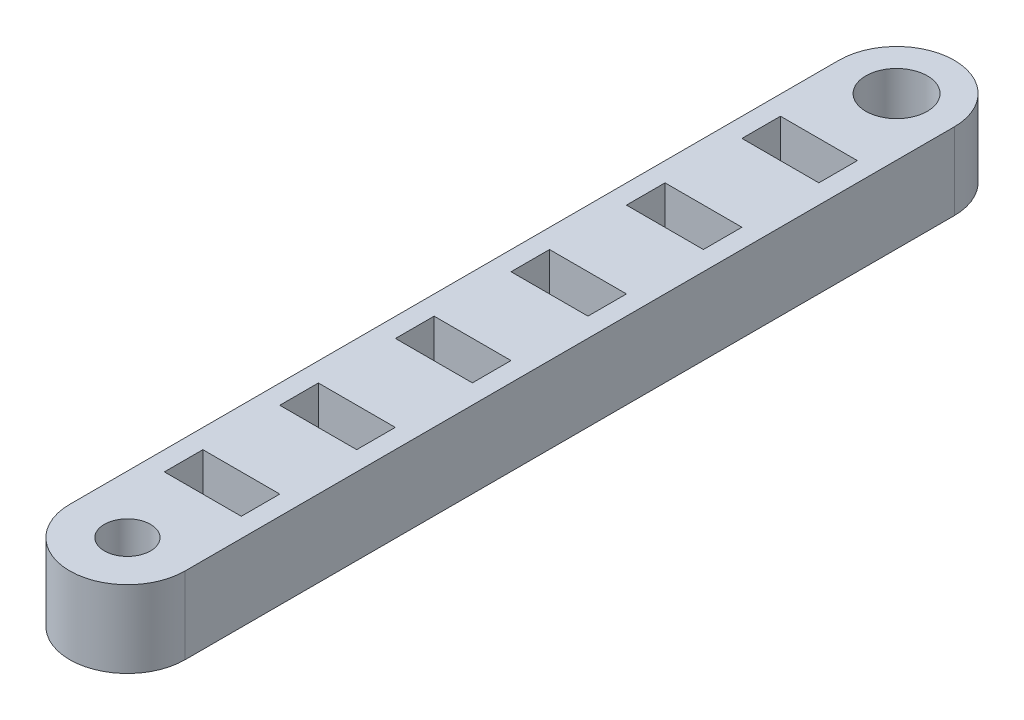
ISO-10303-21;
HEADER;
FILE_DESCRIPTION(('STEP AP214'),'2;1');
FILE_NAME('part.step','',(''),(''),'','','');
FILE_SCHEMA(('AUTOMOTIVE_DESIGN { 1 0 10303 214 1 1 1 1 }'));
ENDSEC;
DATA;
#1=APPLICATION_CONTEXT('core data for automotive mechanical design processes');
#2=APPLICATION_PROTOCOL_DEFINITION('international standard','automotive_design',2000,#1);
#3=PRODUCT_CONTEXT('',#1,'mechanical');
#4=PRODUCT('Part','Part','',(#3));
#5=PRODUCT_RELATED_PRODUCT_CATEGORY('part','',(#4));
#6=PRODUCT_DEFINITION_FORMATION('','',#4);
#7=PRODUCT_DEFINITION_CONTEXT('part definition',#1,'design');
#8=PRODUCT_DEFINITION('design','',#6,#7);
#9=PRODUCT_DEFINITION_SHAPE('','',#8);
#10=(LENGTH_UNIT() NAMED_UNIT(*) SI_UNIT(.MILLI.,.METRE.));
#11=(NAMED_UNIT(*) PLANE_ANGLE_UNIT() SI_UNIT($,.RADIAN.));
#12=(NAMED_UNIT(*) SI_UNIT($,.STERADIAN.) SOLID_ANGLE_UNIT());
#13=UNCERTAINTY_MEASURE_WITH_UNIT(LENGTH_MEASURE(1.E-05),#10,'distance_accuracy_value','');
#14=(GEOMETRIC_REPRESENTATION_CONTEXT(3) GLOBAL_UNCERTAINTY_ASSIGNED_CONTEXT((#13)) GLOBAL_UNIT_ASSIGNED_CONTEXT((#10,
#11,#12)) REPRESENTATION_CONTEXT('',''));
#15=CARTESIAN_POINT('',(0.,0.,0.));
#16=DIRECTION('',(0.,0.,1.));
#17=DIRECTION('',(1.,0.,0.));
#18=AXIS2_PLACEMENT_3D('',#15,#16,#17);
#19=CARTESIAN_POINT('',(5.43082956976471,10.,-63.6643689089613));
#20=DIRECTION('',(0.,-1.,0.));
#21=DIRECTION('',(0.,0.,-1.));
#22=AXIS2_PLACEMENT_3D('',#19,#20,#21);
#23=CYLINDRICAL_SURFACE('',#22,7.5);
#24=CARTESIAN_POINT('',(5.43082956976471,0.,-63.6643689089613));
#25=DIRECTION('',(0.,1.,0.));
#26=DIRECTION('',(0.,0.,1.));
#27=AXIS2_PLACEMENT_3D('',#24,#25,#26);
#28=CIRCLE('',#27,7.5);
#29=CARTESIAN_POINT('',(12.9308295697647,0.,-63.6643689089613));
#30=VERTEX_POINT('',#29);
#31=CARTESIAN_POINT('',(-2.06917043023529,0.,-63.6643689089613));
#32=VERTEX_POINT('',#31);
#33=EDGE_CURVE('E366',#30,#32,#28,.T.);
#34=ORIENTED_EDGE('',*,*,#33,.T.);
#35=DIRECTION('',(0.,-1.,0.));
#36=VECTOR('',#35,1.);
#37=CARTESIAN_POINT('',(-2.06917043023529,10.,-63.6643689089613));
#38=LINE('',#37,#36);
#39=CARTESIAN_POINT('',(-2.06917043023529,10.,-63.6643689089613));
#40=VERTEX_POINT('',#39);
#41=EDGE_CURVE('E382',#40,#32,#38,.T.);
#42=ORIENTED_EDGE('',*,*,#41,.F.);
#43=CARTESIAN_POINT('',(5.43082956976471,10.,-63.6643689089613));
#44=DIRECTION('',(0.,1.,0.));
#45=DIRECTION('',(0.,0.,1.));
#46=AXIS2_PLACEMENT_3D('',#43,#44,#45);
#47=CIRCLE('',#46,7.5);
#48=CARTESIAN_POINT('',(12.9308295697647,10.,-63.6643689089613));
#49=VERTEX_POINT('',#48);
#50=EDGE_CURVE('E355',#49,#40,#47,.T.);
#51=ORIENTED_EDGE('',*,*,#50,.F.);
#52=DIRECTION('',(0.,-1.,0.));
#53=VECTOR('',#52,1.);
#54=CARTESIAN_POINT('',(12.9308295697647,10.,-63.6643689089613));
#55=LINE('',#54,#53);
#56=EDGE_CURVE('E365',#49,#30,#55,.T.);
#57=ORIENTED_EDGE('',*,*,#56,.T.);
#58=EDGE_LOOP('',(#34,#42,#51,#57));
#59=FACE_BOUND('',#58,.T.);
#60=ADVANCED_FACE('F34',(#59),#23,.T.);
#61=CARTESIAN_POINT('',(-2.06917043023529,10.,-63.6643689089613));
#62=DIRECTION('',(1.,0.,0.));
#63=DIRECTION('',(0.,0.,-1.));
#64=AXIS2_PLACEMENT_3D('',#61,#62,#63);
#65=PLANE('',#64);
#66=DIRECTION('',(0.,0.,1.));
#67=VECTOR('',#66,1.);
#68=CARTESIAN_POINT('',(-2.06917043023529,0.,-63.6643689089613));
#69=LINE('',#68,#67);
#70=CARTESIAN_POINT('',(-2.06917043023527,0.,36.3356310910387));
#71=VERTEX_POINT('',#70);
#72=EDGE_CURVE('E369',#32,#71,#69,.T.);
#73=ORIENTED_EDGE('',*,*,#72,.T.);
#74=DIRECTION('',(0.,-1.,0.));
#75=VECTOR('',#74,1.);
#76=CARTESIAN_POINT('',(-2.06917043023527,10.,36.3356310910387));
#77=LINE('',#76,#75);
#78=CARTESIAN_POINT('',(-2.06917043023527,10.,36.3356310910387));
#79=VERTEX_POINT('',#78);
#80=EDGE_CURVE('E379',#79,#71,#77,.T.);
#81=ORIENTED_EDGE('',*,*,#80,.F.);
#82=DIRECTION('',(0.,0.,1.));
#83=VECTOR('',#82,1.);
#84=CARTESIAN_POINT('',(-2.06917043023529,10.,-63.6643689089613));
#85=LINE('',#84,#83);
#86=EDGE_CURVE('E358',#40,#79,#85,.T.);
#87=ORIENTED_EDGE('',*,*,#86,.F.);
#88=ORIENTED_EDGE('',*,*,#41,.T.);
#89=EDGE_LOOP('',(#73,#81,#87,#88));
#90=FACE_BOUND('',#89,.T.);
#91=ADVANCED_FACE('F470',(#90),#65,.F.);
#92=CARTESIAN_POINT('',(5.43082956976472,10.,36.3356310910387));
#93=DIRECTION('',(0.,-1.,0.));
#94=DIRECTION('',(0.,0.,-1.));
#95=AXIS2_PLACEMENT_3D('',#92,#93,#94);
#96=CYLINDRICAL_SURFACE('',#95,7.5);
#97=CARTESIAN_POINT('',(5.43082956976472,0.,36.3356310910387));
#98=DIRECTION('',(0.,1.,0.));
#99=DIRECTION('',(0.,0.,1.));
#100=AXIS2_PLACEMENT_3D('',#97,#98,#99);
#101=CIRCLE('',#100,7.5);
#102=CARTESIAN_POINT('',(12.9308295697647,0.,36.3356310910387));
#103=VERTEX_POINT('',#102);
#104=EDGE_CURVE('E371',#71,#103,#101,.T.);
#105=ORIENTED_EDGE('',*,*,#104,.T.);
#106=DIRECTION('',(0.,-1.,0.));
#107=VECTOR('',#106,1.);
#108=CARTESIAN_POINT('',(12.9308295697647,10.,36.3356310910387));
#109=LINE('',#108,#107);
#110=CARTESIAN_POINT('',(12.9308295697647,10.,36.3356310910387));
#111=VERTEX_POINT('',#110);
#112=EDGE_CURVE('E376',#111,#103,#109,.T.);
#113=ORIENTED_EDGE('',*,*,#112,.F.);
#114=CARTESIAN_POINT('',(5.43082956976472,10.,36.3356310910387));
#115=DIRECTION('',(0.,1.,0.));
#116=DIRECTION('',(0.,0.,1.));
#117=AXIS2_PLACEMENT_3D('',#114,#115,#116);
#118=CIRCLE('',#117,7.5);
#119=EDGE_CURVE('E361',#79,#111,#118,.T.);
#120=ORIENTED_EDGE('',*,*,#119,.F.);
#121=ORIENTED_EDGE('',*,*,#80,.T.);
#122=EDGE_LOOP('',(#105,#113,#120,#121));
#123=FACE_BOUND('',#122,.T.);
#124=ADVANCED_FACE('F475',(#123),#96,.T.);
#125=CARTESIAN_POINT('',(12.9308295697647,10.,-63.6643689089613));
#126=DIRECTION('',(-1.,0.,0.));
#127=DIRECTION('',(0.,0.,1.));
#128=AXIS2_PLACEMENT_3D('',#125,#126,#127);
#129=PLANE('',#128);
#130=DIRECTION('',(0.,0.,-1.));
#131=VECTOR('',#130,1.);
#132=CARTESIAN_POINT('',(12.9308295697647,0.,-63.6643689089613));
#133=LINE('',#132,#131);
#134=EDGE_CURVE('E359',#103,#30,#133,.T.);
#135=ORIENTED_EDGE('',*,*,#134,.T.);
#136=ORIENTED_EDGE('',*,*,#56,.F.);
#137=DIRECTION('',(0.,0.,-1.));
#138=VECTOR('',#137,1.);
#139=CARTESIAN_POINT('',(12.9308295697647,10.,-63.6643689089613));
#140=LINE('',#139,#138);
#141=EDGE_CURVE('E363',#111,#49,#140,.T.);
#142=ORIENTED_EDGE('',*,*,#141,.F.);
#143=ORIENTED_EDGE('',*,*,#112,.T.);
#144=EDGE_LOOP('',(#135,#136,#142,#143));
#145=FACE_BOUND('',#144,.T.);
#146=ADVANCED_FACE('F490',(#145),#129,.F.);
#147=CARTESIAN_POINT('',(5.43082956976471,10.,-63.6643689089613));
#148=DIRECTION('',(0.,1.,0.));
#149=DIRECTION('',(0.,0.,1.));
#150=AXIS2_PLACEMENT_3D('',#147,#148,#149);
#151=PLANE('',#150);
#152=CARTESIAN_POINT('',(5.43082956976472,10.,36.3356310910387));
#153=DIRECTION('',(0.,1.,0.));
#154=DIRECTION('',(0.,0.,1.));
#155=AXIS2_PLACEMENT_3D('',#152,#153,#154);
#156=CIRCLE('',#155,3.);
#157=CARTESIAN_POINT('',(5.43082956976472,10.,39.3356310910387));
#158=VERTEX_POINT('',#157);
#159=EDGE_CURVE('E250',#158,#158,#156,.T.);
#160=ORIENTED_EDGE('',*,*,#159,.F.);
#161=EDGE_LOOP('',(#160));
#162=FACE_BOUND('',#161,.T.);
#163=DIRECTION('',(-1.,0.,0.));
#164=VECTOR('',#163,1.);
#165=CARTESIAN_POINT('',(0.,10.,21.5271605640254));
#166=LINE('',#165,#164);
#167=CARTESIAN_POINT('',(10.4308295697647,10.,21.5271605640254));
#168=VERTEX_POINT('',#167);
#169=CARTESIAN_POINT('',(0.430829569764709,10.,21.5271605640254));
#170=VERTEX_POINT('',#169);
#171=EDGE_CURVE('E49',#168,#170,#166,.T.);
#172=ORIENTED_EDGE('',*,*,#171,.F.);
#173=DIRECTION('',(0.,0.,1.));
#174=VECTOR('',#173,1.);
#175=CARTESIAN_POINT('',(10.4308295697647,10.,0.));
#176=LINE('',#175,#174);
#177=CARTESIAN_POINT('',(10.4308295697647,10.,26.5314364945513));
#178=VERTEX_POINT('',#177);
#179=EDGE_CURVE('E243',#168,#178,#176,.T.);
#180=ORIENTED_EDGE('',*,*,#179,.T.);
#181=DIRECTION('',(-1.,0.,0.));
#182=VECTOR('',#181,1.);
#183=CARTESIAN_POINT('',(0.,10.,26.5314364945513));
#184=LINE('',#183,#182);
#185=CARTESIAN_POINT('',(0.430829569764709,10.,26.5314364945513));
#186=VERTEX_POINT('',#185);
#187=EDGE_CURVE('E226',#178,#186,#184,.T.);
#188=ORIENTED_EDGE('',*,*,#187,.T.);
#189=DIRECTION('',(0.,0.,1.));
#190=VECTOR('',#189,1.);
#191=CARTESIAN_POINT('',(0.430829569764709,10.,0.));
#192=LINE('',#191,#190);
#193=EDGE_CURVE('E236',#170,#186,#192,.T.);
#194=ORIENTED_EDGE('',*,*,#193,.F.);
#195=EDGE_LOOP('',(#172,#180,#188,#194));
#196=FACE_BOUND('',#195,.T.);
#197=DIRECTION('',(-1.,0.,0.));
#198=VECTOR('',#197,1.);
#199=CARTESIAN_POINT('',(0.,10.,6.50984266774373));
#200=LINE('',#199,#198);
#201=CARTESIAN_POINT('',(10.4308295697647,10.,6.50984266774373));
#202=VERTEX_POINT('',#201);
#203=CARTESIAN_POINT('',(0.430829569764708,10.,6.50984266774374));
#204=VERTEX_POINT('',#203);
#205=EDGE_CURVE('E57',#202,#204,#200,.T.);
#206=ORIENTED_EDGE('',*,*,#205,.F.);
#207=DIRECTION('',(0.,0.,1.));
#208=VECTOR('',#207,1.);
#209=CARTESIAN_POINT('',(10.4308295697647,10.,0.));
#210=LINE('',#209,#208);
#211=CARTESIAN_POINT('',(10.4308295697647,10.,11.5271605640254));
#212=VERTEX_POINT('',#211);
#213=EDGE_CURVE('E261',#202,#212,#210,.T.);
#214=ORIENTED_EDGE('',*,*,#213,.T.);
#215=DIRECTION('',(-1.,0.,0.));
#216=VECTOR('',#215,1.);
#217=CARTESIAN_POINT('',(0.,10.,11.5271605640254));
#218=LINE('',#217,#216);
#219=CARTESIAN_POINT('',(0.430829569764709,10.,11.5271605640254));
#220=VERTEX_POINT('',#219);
#221=EDGE_CURVE('E258',#212,#220,#218,.T.);
#222=ORIENTED_EDGE('',*,*,#221,.T.);
#223=DIRECTION('',(0.,0.,1.));
#224=VECTOR('',#223,1.);
#225=CARTESIAN_POINT('',(0.430829569764708,10.,0.));
#226=LINE('',#225,#224);
#227=EDGE_CURVE('E254',#204,#220,#226,.T.);
#228=ORIENTED_EDGE('',*,*,#227,.F.);
#229=EDGE_LOOP('',(#206,#214,#222,#228));
#230=FACE_BOUND('',#229,.T.);
#231=DIRECTION('',(-1.,0.,0.));
#232=VECTOR('',#231,1.);
#233=CARTESIAN_POINT('',(0.,10.,-8.53865228140384));
#234=LINE('',#233,#232);
#235=CARTESIAN_POINT('',(10.4308295697647,10.,-8.53865228140384));
#236=VERTEX_POINT('',#235);
#237=CARTESIAN_POINT('',(0.430829569764709,10.,-8.53865228140384));
#238=VERTEX_POINT('',#237);
#239=EDGE_CURVE('E272',#236,#238,#234,.T.);
#240=ORIENTED_EDGE('',*,*,#239,.F.);
#241=DIRECTION('',(0.,0.,1.));
#242=VECTOR('',#241,1.);
#243=CARTESIAN_POINT('',(10.4308295697647,10.,0.));
#244=LINE('',#243,#242);
#245=CARTESIAN_POINT('',(10.4308295697647,10.,-3.51261248980099));
#246=VERTEX_POINT('',#245);
#247=EDGE_CURVE('E281',#236,#246,#244,.T.);
#248=ORIENTED_EDGE('',*,*,#247,.T.);
#249=DIRECTION('',(-1.,0.,0.));
#250=VECTOR('',#249,1.);
#251=CARTESIAN_POINT('',(0.,10.,-3.51261248980099));
#252=LINE('',#251,#250);
#253=CARTESIAN_POINT('',(0.430829569764709,10.,-3.51261248980099));
#254=VERTEX_POINT('',#253);
#255=EDGE_CURVE('E278',#246,#254,#252,.T.);
#256=ORIENTED_EDGE('',*,*,#255,.T.);
#257=DIRECTION('',(0.,0.,1.));
#258=VECTOR('',#257,1.);
#259=CARTESIAN_POINT('',(0.43082956976471,10.,0.));
#260=LINE('',#259,#258);
#261=EDGE_CURVE('E274',#238,#254,#260,.T.);
#262=ORIENTED_EDGE('',*,*,#261,.F.);
#263=EDGE_LOOP('',(#240,#248,#256,#262));
#264=FACE_BOUND('',#263,.T.);
#265=DIRECTION('',(-1.,0.,0.));
#266=VECTOR('',#265,1.);
#267=CARTESIAN_POINT('',(0.,10.,-23.5445439666619));
#268=LINE('',#267,#266);
#269=CARTESIAN_POINT('',(10.4308295697647,10.,-23.5445439666619));
#270=VERTEX_POINT('',#269);
#271=CARTESIAN_POINT('',(0.430829569764709,10.,-23.5445439666619));
#272=VERTEX_POINT('',#271);
#273=EDGE_CURVE('E292',#270,#272,#268,.T.);
#274=ORIENTED_EDGE('',*,*,#273,.F.);
#275=DIRECTION('',(0.,0.,1.));
#276=VECTOR('',#275,1.);
#277=CARTESIAN_POINT('',(10.4308295697647,10.,0.));
#278=LINE('',#277,#276);
#279=CARTESIAN_POINT('',(10.4308295697647,10.,-18.5386522814038));
#280=VERTEX_POINT('',#279);
#281=EDGE_CURVE('E301',#270,#280,#278,.T.);
#282=ORIENTED_EDGE('',*,*,#281,.T.);
#283=DIRECTION('',(-1.,0.,0.));
#284=VECTOR('',#283,1.);
#285=CARTESIAN_POINT('',(0.,10.,-18.5386522814038));
#286=LINE('',#285,#284);
#287=CARTESIAN_POINT('',(0.430829569764709,10.,-18.5386522814038));
#288=VERTEX_POINT('',#287);
#289=EDGE_CURVE('E298',#280,#288,#286,.T.);
#290=ORIENTED_EDGE('',*,*,#289,.T.);
#291=DIRECTION('',(0.,0.,1.));
#292=VECTOR('',#291,1.);
#293=CARTESIAN_POINT('',(0.430829569764711,10.,0.));
#294=LINE('',#293,#292);
#295=EDGE_CURVE('E294',#272,#288,#294,.T.);
#296=ORIENTED_EDGE('',*,*,#295,.F.);
#297=EDGE_LOOP('',(#274,#282,#290,#296));
#298=FACE_BOUND('',#297,.T.);
#299=DIRECTION('',(-1.,0.,0.));
#300=VECTOR('',#299,1.);
#301=CARTESIAN_POINT('',(0.,10.,-38.5609277801276));
#302=LINE('',#301,#300);
#303=CARTESIAN_POINT('',(10.4308295697647,10.,-38.5609277801276));
#304=VERTEX_POINT('',#303);
#305=CARTESIAN_POINT('',(0.430829569764709,10.,-38.5609277801276));
#306=VERTEX_POINT('',#305);
#307=EDGE_CURVE('E312',#304,#306,#302,.T.);
#308=ORIENTED_EDGE('',*,*,#307,.F.);
#309=DIRECTION('',(0.,0.,1.));
#310=VECTOR('',#309,1.);
#311=CARTESIAN_POINT('',(10.4308295697647,10.,0.));
#312=LINE('',#311,#310);
#313=CARTESIAN_POINT('',(10.4308295697647,10.,-33.5445439666619));
#314=VERTEX_POINT('',#313);
#315=EDGE_CURVE('E321',#304,#314,#312,.T.);
#316=ORIENTED_EDGE('',*,*,#315,.T.);
#317=DIRECTION('',(-1.,0.,0.));
#318=VECTOR('',#317,1.);
#319=CARTESIAN_POINT('',(0.,10.,-33.5445439666619));
#320=LINE('',#319,#318);
#321=CARTESIAN_POINT('',(0.430829569764709,10.,-33.5445439666619));
#322=VERTEX_POINT('',#321);
#323=EDGE_CURVE('E318',#314,#322,#320,.T.);
#324=ORIENTED_EDGE('',*,*,#323,.T.);
#325=DIRECTION('',(0.,0.,1.));
#326=VECTOR('',#325,1.);
#327=CARTESIAN_POINT('',(0.430829569764713,10.,0.));
#328=LINE('',#327,#326);
#329=EDGE_CURVE('E314',#306,#322,#328,.T.);
#330=ORIENTED_EDGE('',*,*,#329,.F.);
#331=EDGE_LOOP('',(#308,#316,#324,#330));
#332=FACE_BOUND('',#331,.T.);
#333=DIRECTION('',(-1.,0.,0.));
#334=VECTOR('',#333,1.);
#335=CARTESIAN_POINT('',(0.,10.,-53.5685338805538));
#336=LINE('',#335,#334);
#337=CARTESIAN_POINT('',(10.4308295697647,10.,-53.5685338805538));
#338=VERTEX_POINT('',#337);
#339=CARTESIAN_POINT('',(0.430829569764709,10.,-53.5685338805538));
#340=VERTEX_POINT('',#339);
#341=EDGE_CURVE('E332',#338,#340,#336,.T.);
#342=ORIENTED_EDGE('',*,*,#341,.F.);
#343=DIRECTION('',(0.,0.,1.));
#344=VECTOR('',#343,1.);
#345=CARTESIAN_POINT('',(10.4308295697647,10.,0.));
#346=LINE('',#345,#344);
#347=CARTESIAN_POINT('',(10.4308295697647,10.,-48.5609277801276));
#348=VERTEX_POINT('',#347);
#349=EDGE_CURVE('E340',#338,#348,#346,.T.);
#350=ORIENTED_EDGE('',*,*,#349,.T.);
#351=DIRECTION('',(-1.,0.,0.));
#352=VECTOR('',#351,1.);
#353=CARTESIAN_POINT('',(0.,10.,-48.5609277801276));
#354=LINE('',#353,#352);
#355=CARTESIAN_POINT('',(0.430829569764709,10.,-48.5609277801276));
#356=VERTEX_POINT('',#355);
#357=EDGE_CURVE('E337',#348,#356,#354,.T.);
#358=ORIENTED_EDGE('',*,*,#357,.T.);
#359=DIRECTION('',(0.,0.,1.));
#360=VECTOR('',#359,1.);
#361=CARTESIAN_POINT('',(0.430829569764715,10.,0.));
#362=LINE('',#361,#360);
#363=EDGE_CURVE('E334',#340,#356,#362,.T.);
#364=ORIENTED_EDGE('',*,*,#363,.F.);
#365=EDGE_LOOP('',(#342,#350,#358,#364));
#366=FACE_BOUND('',#365,.T.);
#367=CARTESIAN_POINT('',(5.43082956976471,10.,-63.6643689089613));
#368=DIRECTION('',(0.,1.,0.));
#369=DIRECTION('',(0.,0.,1.));
#370=AXIS2_PLACEMENT_3D('',#367,#368,#369);
#371=CIRCLE('',#370,4.);
#372=CARTESIAN_POINT('',(5.43082956976471,10.,-59.6643689089613));
#373=VERTEX_POINT('',#372);
#374=EDGE_CURVE('E351',#373,#373,#371,.T.);
#375=ORIENTED_EDGE('',*,*,#374,.F.);
#376=EDGE_LOOP('',(#375));
#377=FACE_BOUND('',#376,.T.);
#378=ORIENTED_EDGE('',*,*,#50,.T.);
#379=ORIENTED_EDGE('',*,*,#86,.T.);
#380=ORIENTED_EDGE('',*,*,#119,.T.);
#381=ORIENTED_EDGE('',*,*,#141,.T.);
#382=EDGE_LOOP('',(#378,#379,#380,#381));
#383=FACE_BOUND('',#382,.T.);
#384=ADVANCED_FACE('F240',(#162,#196,#230,#264,#298,#332,#366,#377,#383),#151,.T.);
#385=CARTESIAN_POINT('',(5.43082956976471,0.,-63.6643689089613));
#386=DIRECTION('',(0.,1.,0.));
#387=DIRECTION('',(0.,0.,1.));
#388=AXIS2_PLACEMENT_3D('',#385,#386,#387);
#389=PLANE('',#388);
#390=CARTESIAN_POINT('',(5.43082956976472,0.,36.3356310910387));
#391=DIRECTION('',(0.,1.,0.));
#392=DIRECTION('',(0.,0.,1.));
#393=AXIS2_PLACEMENT_3D('',#390,#391,#392);
#394=CIRCLE('',#393,3.);
#395=CARTESIAN_POINT('',(5.43082956976472,0.,39.3356310910387));
#396=VERTEX_POINT('',#395);
#397=EDGE_CURVE('E37',#396,#396,#394,.T.);
#398=ORIENTED_EDGE('',*,*,#397,.T.);
#399=EDGE_LOOP('',(#398));
#400=FACE_BOUND('',#399,.T.);
#401=DIRECTION('',(0.,0.,1.));
#402=VECTOR('',#401,1.);
#403=CARTESIAN_POINT('',(10.4308295697647,0.,-63.6643689089613));
#404=LINE('',#403,#402);
#405=CARTESIAN_POINT('',(10.4308295697647,0.,21.5271605640254));
#406=VERTEX_POINT('',#405);
#407=CARTESIAN_POINT('',(10.4308295697647,0.,26.5314364945513));
#408=VERTEX_POINT('',#407);
#409=EDGE_CURVE('E42',#406,#408,#404,.T.);
#410=ORIENTED_EDGE('',*,*,#409,.F.);
#411=DIRECTION('',(-1.,0.,0.));
#412=VECTOR('',#411,1.);
#413=CARTESIAN_POINT('',(5.43082956976471,0.,21.5271605640254));
#414=LINE('',#413,#412);
#415=CARTESIAN_POINT('',(0.430829569764709,0.,21.5271605640254));
#416=VERTEX_POINT('',#415);
#417=EDGE_CURVE('E11',#406,#416,#414,.T.);
#418=ORIENTED_EDGE('',*,*,#417,.T.);
#419=DIRECTION('',(0.,0.,1.));
#420=VECTOR('',#419,1.);
#421=CARTESIAN_POINT('',(0.430829569764709,0.,-63.6643689089613));
#422=LINE('',#421,#420);
#423=CARTESIAN_POINT('',(0.430829569764709,0.,26.5314364945513));
#424=VERTEX_POINT('',#423);
#425=EDGE_CURVE('E442',#416,#424,#422,.T.);
#426=ORIENTED_EDGE('',*,*,#425,.T.);
#427=DIRECTION('',(-1.,0.,0.));
#428=VECTOR('',#427,1.);
#429=CARTESIAN_POINT('',(5.43082956976471,0.,26.5314364945513));
#430=LINE('',#429,#428);
#431=EDGE_CURVE('E229',#408,#424,#430,.T.);
#432=ORIENTED_EDGE('',*,*,#431,.F.);
#433=EDGE_LOOP('',(#410,#418,#426,#432));
#434=FACE_BOUND('',#433,.T.);
#435=DIRECTION('',(0.,0.,1.));
#436=VECTOR('',#435,1.);
#437=CARTESIAN_POINT('',(10.4308295697647,0.,-63.6643689089613));
#438=LINE('',#437,#436);
#439=CARTESIAN_POINT('',(10.4308295697647,0.,6.50984266774373));
#440=VERTEX_POINT('',#439);
#441=CARTESIAN_POINT('',(10.4308295697647,0.,11.5271605640254));
#442=VERTEX_POINT('',#441);
#443=EDGE_CURVE('E437',#440,#442,#438,.T.);
#444=ORIENTED_EDGE('',*,*,#443,.F.);
#445=DIRECTION('',(-1.,0.,0.));
#446=VECTOR('',#445,1.);
#447=CARTESIAN_POINT('',(5.43082956976466,0.,6.50984266774374));
#448=LINE('',#447,#446);
#449=CARTESIAN_POINT('',(0.430829569764709,0.,6.50984266774373));
#450=VERTEX_POINT('',#449);
#451=EDGE_CURVE('E439',#440,#450,#448,.T.);
#452=ORIENTED_EDGE('',*,*,#451,.T.);
#453=DIRECTION('',(0.,0.,1.));
#454=VECTOR('',#453,1.);
#455=CARTESIAN_POINT('',(0.4308295697647,0.,-63.6643689089613));
#456=LINE('',#455,#454);
#457=CARTESIAN_POINT('',(0.430829569764709,0.,11.5271605640254));
#458=VERTEX_POINT('',#457);
#459=EDGE_CURVE('E431',#450,#458,#456,.T.);
#460=ORIENTED_EDGE('',*,*,#459,.T.);
#461=DIRECTION('',(-1.,0.,0.));
#462=VECTOR('',#461,1.);
#463=CARTESIAN_POINT('',(5.43082956976472,0.,11.5271605640254));
#464=LINE('',#463,#462);
#465=EDGE_CURVE('E434',#442,#458,#464,.T.);
#466=ORIENTED_EDGE('',*,*,#465,.F.);
#467=EDGE_LOOP('',(#444,#452,#460,#466));
#468=FACE_BOUND('',#467,.T.);
#469=DIRECTION('',(0.,0.,1.));
#470=VECTOR('',#469,1.);
#471=CARTESIAN_POINT('',(10.4308295697647,0.,-63.6643689089613));
#472=LINE('',#471,#470);
#473=CARTESIAN_POINT('',(10.4308295697647,0.,-8.53865228140384));
#474=VERTEX_POINT('',#473);
#475=CARTESIAN_POINT('',(10.4308295697647,0.,-3.51261248980099));
#476=VERTEX_POINT('',#475);
#477=EDGE_CURVE('E426',#474,#476,#472,.T.);
#478=ORIENTED_EDGE('',*,*,#477,.F.);
#479=DIRECTION('',(-1.,0.,0.));
#480=VECTOR('',#479,1.);
#481=CARTESIAN_POINT('',(5.43082956976471,0.,-8.53865228140384));
#482=LINE('',#481,#480);
#483=CARTESIAN_POINT('',(0.430829569764709,0.,-8.53865228140384));
#484=VERTEX_POINT('',#483);
#485=EDGE_CURVE('E428',#474,#484,#482,.T.);
#486=ORIENTED_EDGE('',*,*,#485,.T.);
#487=DIRECTION('',(0.,0.,1.));
#488=VECTOR('',#487,1.);
#489=CARTESIAN_POINT('',(0.430829569764702,0.,-63.6643689089613));
#490=LINE('',#489,#488);
#491=CARTESIAN_POINT('',(0.430829569764709,0.,-3.51261248980099));
#492=VERTEX_POINT('',#491);
#493=EDGE_CURVE('E420',#484,#492,#490,.T.);
#494=ORIENTED_EDGE('',*,*,#493,.T.);
#495=DIRECTION('',(-1.,0.,0.));
#496=VECTOR('',#495,1.);
#497=CARTESIAN_POINT('',(5.43082956976472,0.,-3.51261248980098));
#498=LINE('',#497,#496);
#499=EDGE_CURVE('E423',#476,#492,#498,.T.);
#500=ORIENTED_EDGE('',*,*,#499,.F.);
#501=EDGE_LOOP('',(#478,#486,#494,#500));
#502=FACE_BOUND('',#501,.T.);
#503=DIRECTION('',(0.,0.,1.));
#504=VECTOR('',#503,1.);
#505=CARTESIAN_POINT('',(10.4308295697647,0.,-63.6643689089613));
#506=LINE('',#505,#504);
#507=CARTESIAN_POINT('',(10.4308295697647,0.,-23.5445439666619));
#508=VERTEX_POINT('',#507);
#509=CARTESIAN_POINT('',(10.4308295697647,0.,-18.5386522814038));
#510=VERTEX_POINT('',#509);
#511=EDGE_CURVE('E415',#508,#510,#506,.T.);
#512=ORIENTED_EDGE('',*,*,#511,.F.);
#513=DIRECTION('',(-1.,0.,0.));
#514=VECTOR('',#513,1.);
#515=CARTESIAN_POINT('',(5.43082956976476,0.,-23.5445439666619));
#516=LINE('',#515,#514);
#517=CARTESIAN_POINT('',(0.430829569764709,0.,-23.5445439666619));
#518=VERTEX_POINT('',#517);
#519=EDGE_CURVE('E417',#508,#518,#516,.T.);
#520=ORIENTED_EDGE('',*,*,#519,.T.);
#521=DIRECTION('',(0.,0.,1.));
#522=VECTOR('',#521,1.);
#523=CARTESIAN_POINT('',(0.430829569764704,0.,-63.6643689089613));
#524=LINE('',#523,#522);
#525=CARTESIAN_POINT('',(0.430829569764709,0.,-18.5386522814038));
#526=VERTEX_POINT('',#525);
#527=EDGE_CURVE('E409',#518,#526,#524,.T.);
#528=ORIENTED_EDGE('',*,*,#527,.T.);
#529=DIRECTION('',(-1.,0.,0.));
#530=VECTOR('',#529,1.);
#531=CARTESIAN_POINT('',(5.43082956976471,0.,-18.5386522814038));
#532=LINE('',#531,#530);
#533=EDGE_CURVE('E412',#510,#526,#532,.T.);
#534=ORIENTED_EDGE('',*,*,#533,.F.);
#535=EDGE_LOOP('',(#512,#520,#528,#534));
#536=FACE_BOUND('',#535,.T.);
#537=DIRECTION('',(0.,0.,1.));
#538=VECTOR('',#537,1.);
#539=CARTESIAN_POINT('',(10.4308295697647,0.,-63.6643689089613));
#540=LINE('',#539,#538);
#541=CARTESIAN_POINT('',(10.4308295697647,0.,-38.5609277801276));
#542=VERTEX_POINT('',#541);
#543=CARTESIAN_POINT('',(10.4308295697647,0.,-33.5445439666619));
#544=VERTEX_POINT('',#543);
#545=EDGE_CURVE('E404',#542,#544,#540,.T.);
#546=ORIENTED_EDGE('',*,*,#545,.F.);
#547=DIRECTION('',(-1.,0.,0.));
#548=VECTOR('',#547,1.);
#549=CARTESIAN_POINT('',(5.43082956976471,0.,-38.5609277801276));
#550=LINE('',#549,#548);
#551=CARTESIAN_POINT('',(0.430829569764709,0.,-38.5609277801276));
#552=VERTEX_POINT('',#551);
#553=EDGE_CURVE('E406',#542,#552,#550,.T.);
#554=ORIENTED_EDGE('',*,*,#553,.T.);
#555=DIRECTION('',(0.,0.,1.));
#556=VECTOR('',#555,1.);
#557=CARTESIAN_POINT('',(0.430829569764706,0.,-63.6643689089613));
#558=LINE('',#557,#556);
#559=CARTESIAN_POINT('',(0.430829569764709,0.,-33.5445439666619));
#560=VERTEX_POINT('',#559);
#561=EDGE_CURVE('E398',#552,#560,#558,.T.);
#562=ORIENTED_EDGE('',*,*,#561,.T.);
#563=DIRECTION('',(-1.,0.,0.));
#564=VECTOR('',#563,1.);
#565=CARTESIAN_POINT('',(5.43082956976471,0.,-33.5445439666619));
#566=LINE('',#565,#564);
#567=EDGE_CURVE('E401',#544,#560,#566,.T.);
#568=ORIENTED_EDGE('',*,*,#567,.F.);
#569=EDGE_LOOP('',(#546,#554,#562,#568));
#570=FACE_BOUND('',#569,.T.);
#571=DIRECTION('',(0.,0.,1.));
#572=VECTOR('',#571,1.);
#573=CARTESIAN_POINT('',(10.4308295697647,0.,-63.6643689089613));
#574=LINE('',#573,#572);
#575=CARTESIAN_POINT('',(10.4308295697647,0.,-53.5685338805538));
#576=VERTEX_POINT('',#575);
#577=CARTESIAN_POINT('',(10.4308295697647,0.,-48.5609277801276));
#578=VERTEX_POINT('',#577);
#579=EDGE_CURVE('E393',#576,#578,#574,.T.);
#580=ORIENTED_EDGE('',*,*,#579,.F.);
#581=DIRECTION('',(-1.,0.,0.));
#582=VECTOR('',#581,1.);
#583=CARTESIAN_POINT('',(5.43082956976471,0.,-53.5685338805538));
#584=LINE('',#583,#582);
#585=CARTESIAN_POINT('',(0.430829569764709,0.,-53.5685338805538));
#586=VERTEX_POINT('',#585);
#587=EDGE_CURVE('E395',#576,#586,#584,.T.);
#588=ORIENTED_EDGE('',*,*,#587,.T.);
#589=DIRECTION('',(0.,0.,1.));
#590=VECTOR('',#589,1.);
#591=CARTESIAN_POINT('',(0.430829569764707,0.,-63.6643689089613));
#592=LINE('',#591,#590);
#593=CARTESIAN_POINT('',(0.430829569764709,0.,-48.5609277801276));
#594=VERTEX_POINT('',#593);
#595=EDGE_CURVE('E385',#586,#594,#592,.T.);
#596=ORIENTED_EDGE('',*,*,#595,.T.);
#597=DIRECTION('',(-1.,0.,0.));
#598=VECTOR('',#597,1.);
#599=CARTESIAN_POINT('',(5.43082956976471,0.,-48.5609277801276));
#600=LINE('',#599,#598);
#601=EDGE_CURVE('E390',#578,#594,#600,.T.);
#602=ORIENTED_EDGE('',*,*,#601,.F.);
#603=EDGE_LOOP('',(#580,#588,#596,#602));
#604=FACE_BOUND('',#603,.T.);
#605=CARTESIAN_POINT('',(5.43082956976471,0.,-63.6643689089613));
#606=DIRECTION('',(0.,1.,0.));
#607=DIRECTION('',(0.,0.,1.));
#608=AXIS2_PLACEMENT_3D('',#605,#606,#607);
#609=CIRCLE('',#608,4.);
#610=CARTESIAN_POINT('',(5.43082956976471,0.,-59.6643689089613));
#611=VERTEX_POINT('',#610);
#612=EDGE_CURVE('E354',#611,#611,#609,.T.);
#613=ORIENTED_EDGE('',*,*,#612,.T.);
#614=EDGE_LOOP('',(#613));
#615=FACE_BOUND('',#614,.T.);
#616=ORIENTED_EDGE('',*,*,#33,.F.);
#617=ORIENTED_EDGE('',*,*,#134,.F.);
#618=ORIENTED_EDGE('',*,*,#104,.F.);
#619=ORIENTED_EDGE('',*,*,#72,.F.);
#620=EDGE_LOOP('',(#616,#617,#618,#619));
#621=FACE_BOUND('',#620,.T.);
#622=ADVANCED_FACE('F450',(#400,#434,#468,#502,#536,#570,#604,#615,#621),#389,.F.);
#623=CARTESIAN_POINT('',(5.43082956976471,-12.,-63.6643689089613));
#624=DIRECTION('',(0.,1.,0.));
#625=DIRECTION('',(0.,0.,1.));
#626=AXIS2_PLACEMENT_3D('',#623,#624,#625);
#627=CYLINDRICAL_SURFACE('',#626,4.);
#628=ORIENTED_EDGE('',*,*,#374,.T.);
#629=EDGE_LOOP('',(#628));
#630=FACE_BOUND('',#629,.T.);
#631=ORIENTED_EDGE('',*,*,#612,.F.);
#632=EDGE_LOOP('',(#631));
#633=FACE_BOUND('',#632,.T.);
#634=ADVANCED_FACE('F501',(#630,#633),#627,.F.);
#635=CARTESIAN_POINT('',(0.,-10.,-53.5685338805538));
#636=DIRECTION('',(0.,0.,-1.));
#637=DIRECTION('',(-1.,0.,0.));
#638=AXIS2_PLACEMENT_3D('',#635,#636,#637);
#639=PLANE('',#638);
#640=DIRECTION('',(0.,1.,0.));
#641=VECTOR('',#640,1.);
#642=CARTESIAN_POINT('',(10.4308295697647,-10.,-53.5685338805538));
#643=LINE('',#642,#641);
#644=EDGE_CURVE('E315',#576,#338,#643,.T.);
#645=ORIENTED_EDGE('',*,*,#644,.T.);
#646=ORIENTED_EDGE('',*,*,#341,.T.);
#647=DIRECTION('',(0.,1.,0.));
#648=VECTOR('',#647,1.);
#649=CARTESIAN_POINT('',(0.430829569764709,-10.,-53.5685338805538));
#650=LINE('',#649,#648);
#651=EDGE_CURVE('E343',#586,#340,#650,.T.);
#652=ORIENTED_EDGE('',*,*,#651,.F.);
#653=ORIENTED_EDGE('',*,*,#587,.F.);
#654=EDGE_LOOP('',(#645,#646,#652,#653));
#655=FACE_BOUND('',#654,.T.);
#656=ADVANCED_FACE('F507',(#655),#639,.F.);
#657=CARTESIAN_POINT('',(10.4308295697647,-10.,0.));
#658=DIRECTION('',(-1.,0.,0.));
#659=DIRECTION('',(0.,0.,1.));
#660=AXIS2_PLACEMENT_3D('',#657,#658,#659);
#661=PLANE('',#660);
#662=ORIENTED_EDGE('',*,*,#579,.T.);
#663=DIRECTION('',(0.,1.,0.));
#664=VECTOR('',#663,1.);
#665=CARTESIAN_POINT('',(10.4308295697647,-10.,-48.5609277801276));
#666=LINE('',#665,#664);
#667=EDGE_CURVE('E345',#578,#348,#666,.T.);
#668=ORIENTED_EDGE('',*,*,#667,.T.);
#669=ORIENTED_EDGE('',*,*,#349,.F.);
#670=ORIENTED_EDGE('',*,*,#644,.F.);
#671=EDGE_LOOP('',(#662,#668,#669,#670));
#672=FACE_BOUND('',#671,.T.);
#673=ADVANCED_FACE('F511',(#672),#661,.T.);
#674=CARTESIAN_POINT('',(0.,-10.,-48.5609277801276));
#675=DIRECTION('',(0.,0.,-1.));
#676=DIRECTION('',(-1.,0.,0.));
#677=AXIS2_PLACEMENT_3D('',#674,#675,#676);
#678=PLANE('',#677);
#679=ORIENTED_EDGE('',*,*,#601,.T.);
#680=DIRECTION('',(0.,1.,0.));
#681=VECTOR('',#680,1.);
#682=CARTESIAN_POINT('',(0.430829569764709,-10.,-48.5609277801276));
#683=LINE('',#682,#681);
#684=EDGE_CURVE('E347',#594,#356,#683,.T.);
#685=ORIENTED_EDGE('',*,*,#684,.T.);
#686=ORIENTED_EDGE('',*,*,#357,.F.);
#687=ORIENTED_EDGE('',*,*,#667,.F.);
#688=EDGE_LOOP('',(#679,#685,#686,#687));
#689=FACE_BOUND('',#688,.T.);
#690=ADVANCED_FACE('F517',(#689),#678,.T.);
#691=CARTESIAN_POINT('',(0.430829569764715,-10.,0.));
#692=DIRECTION('',(-1.,0.,0.));
#693=DIRECTION('',(0.,0.,1.));
#694=AXIS2_PLACEMENT_3D('',#691,#692,#693);
#695=PLANE('',#694);
#696=ORIENTED_EDGE('',*,*,#651,.T.);
#697=ORIENTED_EDGE('',*,*,#363,.T.);
#698=ORIENTED_EDGE('',*,*,#684,.F.);
#699=ORIENTED_EDGE('',*,*,#595,.F.);
#700=EDGE_LOOP('',(#696,#697,#698,#699));
#701=FACE_BOUND('',#700,.T.);
#702=ADVANCED_FACE('F513',(#701),#695,.F.);
#703=CARTESIAN_POINT('',(0.,-10.,-38.5609277801276));
#704=DIRECTION('',(0.,0.,-1.));
#705=DIRECTION('',(-1.,0.,0.));
#706=AXIS2_PLACEMENT_3D('',#703,#704,#705);
#707=PLANE('',#706);
#708=DIRECTION('',(0.,1.,0.));
#709=VECTOR('',#708,1.);
#710=CARTESIAN_POINT('',(10.4308295697647,-10.,-38.5609277801276));
#711=LINE('',#710,#709);
#712=EDGE_CURVE('E295',#542,#304,#711,.T.);
#713=ORIENTED_EDGE('',*,*,#712,.T.);
#714=ORIENTED_EDGE('',*,*,#307,.T.);
#715=DIRECTION('',(0.,1.,0.));
#716=VECTOR('',#715,1.);
#717=CARTESIAN_POINT('',(0.430829569764709,-10.,-38.5609277801276));
#718=LINE('',#717,#716);
#719=EDGE_CURVE('E324',#552,#306,#718,.T.);
#720=ORIENTED_EDGE('',*,*,#719,.F.);
#721=ORIENTED_EDGE('',*,*,#553,.F.);
#722=EDGE_LOOP('',(#713,#714,#720,#721));
#723=FACE_BOUND('',#722,.T.);
#724=ADVANCED_FACE('F516',(#723),#707,.F.);
#725=CARTESIAN_POINT('',(10.4308295697647,-10.,0.));
#726=DIRECTION('',(-1.,0.,0.));
#727=DIRECTION('',(0.,0.,1.));
#728=AXIS2_PLACEMENT_3D('',#725,#726,#727);
#729=PLANE('',#728);
#730=ORIENTED_EDGE('',*,*,#545,.T.);
#731=DIRECTION('',(0.,1.,0.));
#732=VECTOR('',#731,1.);
#733=CARTESIAN_POINT('',(10.4308295697647,-10.,-33.5445439666619));
#734=LINE('',#733,#732);
#735=EDGE_CURVE('E326',#544,#314,#734,.T.);
#736=ORIENTED_EDGE('',*,*,#735,.T.);
#737=ORIENTED_EDGE('',*,*,#315,.F.);
#738=ORIENTED_EDGE('',*,*,#712,.F.);
#739=EDGE_LOOP('',(#730,#736,#737,#738));
#740=FACE_BOUND('',#739,.T.);
#741=ADVANCED_FACE('F527',(#740),#729,.T.);
#742=CARTESIAN_POINT('',(0.,-10.,-33.5445439666619));
#743=DIRECTION('',(0.,0.,-1.));
#744=DIRECTION('',(-1.,0.,0.));
#745=AXIS2_PLACEMENT_3D('',#742,#743,#744);
#746=PLANE('',#745);
#747=ORIENTED_EDGE('',*,*,#567,.T.);
#748=DIRECTION('',(0.,1.,0.));
#749=VECTOR('',#748,1.);
#750=CARTESIAN_POINT('',(0.430829569764709,-10.,-33.5445439666619));
#751=LINE('',#750,#749);
#752=EDGE_CURVE('E328',#560,#322,#751,.T.);
#753=ORIENTED_EDGE('',*,*,#752,.T.);
#754=ORIENTED_EDGE('',*,*,#323,.F.);
#755=ORIENTED_EDGE('',*,*,#735,.F.);
#756=EDGE_LOOP('',(#747,#753,#754,#755));
#757=FACE_BOUND('',#756,.T.);
#758=ADVANCED_FACE('F533',(#757),#746,.T.);
#759=CARTESIAN_POINT('',(0.430829569764713,-10.,0.));
#760=DIRECTION('',(-1.,0.,0.));
#761=DIRECTION('',(0.,0.,1.));
#762=AXIS2_PLACEMENT_3D('',#759,#760,#761);
#763=PLANE('',#762);
#764=ORIENTED_EDGE('',*,*,#719,.T.);
#765=ORIENTED_EDGE('',*,*,#329,.T.);
#766=ORIENTED_EDGE('',*,*,#752,.F.);
#767=ORIENTED_EDGE('',*,*,#561,.F.);
#768=EDGE_LOOP('',(#764,#765,#766,#767));
#769=FACE_BOUND('',#768,.T.);
#770=ADVANCED_FACE('F529',(#769),#763,.F.);
#771=CARTESIAN_POINT('',(0.,-10.,-23.5445439666619));
#772=DIRECTION('',(0.,0.,-1.));
#773=DIRECTION('',(-1.,0.,0.));
#774=AXIS2_PLACEMENT_3D('',#771,#772,#773);
#775=PLANE('',#774);
#776=DIRECTION('',(0.,1.,0.));
#777=VECTOR('',#776,1.);
#778=CARTESIAN_POINT('',(10.4308295697647,-10.,-23.5445439666619));
#779=LINE('',#778,#777);
#780=EDGE_CURVE('E275',#508,#270,#779,.T.);
#781=ORIENTED_EDGE('',*,*,#780,.T.);
#782=ORIENTED_EDGE('',*,*,#273,.T.);
#783=DIRECTION('',(0.,1.,0.));
#784=VECTOR('',#783,1.);
#785=CARTESIAN_POINT('',(0.430829569764709,-10.,-23.5445439666619));
#786=LINE('',#785,#784);
#787=EDGE_CURVE('E304',#518,#272,#786,.T.);
#788=ORIENTED_EDGE('',*,*,#787,.F.);
#789=ORIENTED_EDGE('',*,*,#519,.F.);
#790=EDGE_LOOP('',(#781,#782,#788,#789));
#791=FACE_BOUND('',#790,.T.);
#792=ADVANCED_FACE('F532',(#791),#775,.F.);
#793=CARTESIAN_POINT('',(10.4308295697647,-10.,0.));
#794=DIRECTION('',(-1.,0.,0.));
#795=DIRECTION('',(0.,0.,1.));
#796=AXIS2_PLACEMENT_3D('',#793,#794,#795);
#797=PLANE('',#796);
#798=ORIENTED_EDGE('',*,*,#511,.T.);
#799=DIRECTION('',(0.,1.,0.));
#800=VECTOR('',#799,1.);
#801=CARTESIAN_POINT('',(10.4308295697647,-10.,-18.5386522814038));
#802=LINE('',#801,#800);
#803=EDGE_CURVE('E306',#510,#280,#802,.T.);
#804=ORIENTED_EDGE('',*,*,#803,.T.);
#805=ORIENTED_EDGE('',*,*,#281,.F.);
#806=ORIENTED_EDGE('',*,*,#780,.F.);
#807=EDGE_LOOP('',(#798,#804,#805,#806));
#808=FACE_BOUND('',#807,.T.);
#809=ADVANCED_FACE('F543',(#808),#797,.T.);
#810=CARTESIAN_POINT('',(0.,-10.,-18.5386522814038));
#811=DIRECTION('',(0.,0.,-1.));
#812=DIRECTION('',(-1.,0.,0.));
#813=AXIS2_PLACEMENT_3D('',#810,#811,#812);
#814=PLANE('',#813);
#815=ORIENTED_EDGE('',*,*,#533,.T.);
#816=DIRECTION('',(0.,1.,0.));
#817=VECTOR('',#816,1.);
#818=CARTESIAN_POINT('',(0.430829569764709,-10.,-18.5386522814038));
#819=LINE('',#818,#817);
#820=EDGE_CURVE('E308',#526,#288,#819,.T.);
#821=ORIENTED_EDGE('',*,*,#820,.T.);
#822=ORIENTED_EDGE('',*,*,#289,.F.);
#823=ORIENTED_EDGE('',*,*,#803,.F.);
#824=EDGE_LOOP('',(#815,#821,#822,#823));
#825=FACE_BOUND('',#824,.T.);
#826=ADVANCED_FACE('F549',(#825),#814,.T.);
#827=CARTESIAN_POINT('',(0.430829569764711,-10.,0.));
#828=DIRECTION('',(-1.,0.,0.));
#829=DIRECTION('',(0.,0.,1.));
#830=AXIS2_PLACEMENT_3D('',#827,#828,#829);
#831=PLANE('',#830);
#832=ORIENTED_EDGE('',*,*,#787,.T.);
#833=ORIENTED_EDGE('',*,*,#295,.T.);
#834=ORIENTED_EDGE('',*,*,#820,.F.);
#835=ORIENTED_EDGE('',*,*,#527,.F.);
#836=EDGE_LOOP('',(#832,#833,#834,#835));
#837=FACE_BOUND('',#836,.T.);
#838=ADVANCED_FACE('F545',(#837),#831,.F.);
#839=CARTESIAN_POINT('',(0.,-10.,-8.53865228140384));
#840=DIRECTION('',(0.,0.,-1.));
#841=DIRECTION('',(-1.,0.,0.));
#842=AXIS2_PLACEMENT_3D('',#839,#840,#841);
#843=PLANE('',#842);
#844=DIRECTION('',(0.,1.,0.));
#845=VECTOR('',#844,1.);
#846=CARTESIAN_POINT('',(10.4308295697647,-10.,-8.53865228140384));
#847=LINE('',#846,#845);
#848=EDGE_CURVE('E255',#474,#236,#847,.T.);
#849=ORIENTED_EDGE('',*,*,#848,.T.);
#850=ORIENTED_EDGE('',*,*,#239,.T.);
#851=DIRECTION('',(0.,1.,0.));
#852=VECTOR('',#851,1.);
#853=CARTESIAN_POINT('',(0.430829569764709,-10.,-8.53865228140384));
#854=LINE('',#853,#852);
#855=EDGE_CURVE('E284',#484,#238,#854,.T.);
#856=ORIENTED_EDGE('',*,*,#855,.F.);
#857=ORIENTED_EDGE('',*,*,#485,.F.);
#858=EDGE_LOOP('',(#849,#850,#856,#857));
#859=FACE_BOUND('',#858,.T.);
#860=ADVANCED_FACE('F548',(#859),#843,.F.);
#861=CARTESIAN_POINT('',(10.4308295697647,-10.,0.));
#862=DIRECTION('',(-1.,0.,0.));
#863=DIRECTION('',(0.,0.,1.));
#864=AXIS2_PLACEMENT_3D('',#861,#862,#863);
#865=PLANE('',#864);
#866=ORIENTED_EDGE('',*,*,#477,.T.);
#867=DIRECTION('',(0.,1.,0.));
#868=VECTOR('',#867,1.);
#869=CARTESIAN_POINT('',(10.4308295697647,-10.,-3.51261248980099));
#870=LINE('',#869,#868);
#871=EDGE_CURVE('E286',#476,#246,#870,.T.);
#872=ORIENTED_EDGE('',*,*,#871,.T.);
#873=ORIENTED_EDGE('',*,*,#247,.F.);
#874=ORIENTED_EDGE('',*,*,#848,.F.);
#875=EDGE_LOOP('',(#866,#872,#873,#874));
#876=FACE_BOUND('',#875,.T.);
#877=ADVANCED_FACE('F559',(#876),#865,.T.);
#878=CARTESIAN_POINT('',(0.,-10.,-3.51261248980099));
#879=DIRECTION('',(0.,0.,-1.));
#880=DIRECTION('',(-1.,0.,0.));
#881=AXIS2_PLACEMENT_3D('',#878,#879,#880);
#882=PLANE('',#881);
#883=ORIENTED_EDGE('',*,*,#499,.T.);
#884=DIRECTION('',(0.,1.,0.));
#885=VECTOR('',#884,1.);
#886=CARTESIAN_POINT('',(0.430829569764709,-10.,-3.51261248980099));
#887=LINE('',#886,#885);
#888=EDGE_CURVE('E288',#492,#254,#887,.T.);
#889=ORIENTED_EDGE('',*,*,#888,.T.);
#890=ORIENTED_EDGE('',*,*,#255,.F.);
#891=ORIENTED_EDGE('',*,*,#871,.F.);
#892=EDGE_LOOP('',(#883,#889,#890,#891));
#893=FACE_BOUND('',#892,.T.);
#894=ADVANCED_FACE('F565',(#893),#882,.T.);
#895=CARTESIAN_POINT('',(0.43082956976471,-10.,0.));
#896=DIRECTION('',(-1.,0.,0.));
#897=DIRECTION('',(0.,0.,1.));
#898=AXIS2_PLACEMENT_3D('',#895,#896,#897);
#899=PLANE('',#898);
#900=ORIENTED_EDGE('',*,*,#855,.T.);
#901=ORIENTED_EDGE('',*,*,#261,.T.);
#902=ORIENTED_EDGE('',*,*,#888,.F.);
#903=ORIENTED_EDGE('',*,*,#493,.F.);
#904=EDGE_LOOP('',(#900,#901,#902,#903));
#905=FACE_BOUND('',#904,.T.);
#906=ADVANCED_FACE('F561',(#905),#899,.F.);
#907=CARTESIAN_POINT('',(0.,-10.,6.50984266774373));
#908=DIRECTION('',(0.,0.,-1.));
#909=DIRECTION('',(-1.,0.,0.));
#910=AXIS2_PLACEMENT_3D('',#907,#908,#909);
#911=PLANE('',#910);
#912=DIRECTION('',(0.,1.,0.));
#913=VECTOR('',#912,1.);
#914=CARTESIAN_POINT('',(10.4308295697647,-10.,6.50984266774373));
#915=LINE('',#914,#913);
#916=EDGE_CURVE('E265',#440,#202,#915,.T.);
#917=ORIENTED_EDGE('',*,*,#916,.T.);
#918=ORIENTED_EDGE('',*,*,#205,.T.);
#919=DIRECTION('',(0.,1.,0.));
#920=VECTOR('',#919,1.);
#921=CARTESIAN_POINT('',(0.430829569764709,-10.,6.50984266774373));
#922=LINE('',#921,#920);
#923=EDGE_CURVE('E264',#450,#204,#922,.T.);
#924=ORIENTED_EDGE('',*,*,#923,.F.);
#925=ORIENTED_EDGE('',*,*,#451,.F.);
#926=EDGE_LOOP('',(#917,#918,#924,#925));
#927=FACE_BOUND('',#926,.T.);
#928=ADVANCED_FACE('F564',(#927),#911,.F.);
#929=CARTESIAN_POINT('',(10.4308295697647,-10.,0.));
#930=DIRECTION('',(-1.,0.,0.));
#931=DIRECTION('',(0.,0.,1.));
#932=AXIS2_PLACEMENT_3D('',#929,#930,#931);
#933=PLANE('',#932);
#934=ORIENTED_EDGE('',*,*,#443,.T.);
#935=DIRECTION('',(0.,1.,0.));
#936=VECTOR('',#935,1.);
#937=CARTESIAN_POINT('',(10.4308295697647,-10.,11.5271605640254));
#938=LINE('',#937,#936);
#939=EDGE_CURVE('E267',#442,#212,#938,.T.);
#940=ORIENTED_EDGE('',*,*,#939,.T.);
#941=ORIENTED_EDGE('',*,*,#213,.F.);
#942=ORIENTED_EDGE('',*,*,#916,.F.);
#943=EDGE_LOOP('',(#934,#940,#941,#942));
#944=FACE_BOUND('',#943,.T.);
#945=ADVANCED_FACE('F575',(#944),#933,.T.);
#946=CARTESIAN_POINT('',(0.,-10.,11.5271605640254));
#947=DIRECTION('',(0.,0.,-1.));
#948=DIRECTION('',(-1.,0.,0.));
#949=AXIS2_PLACEMENT_3D('',#946,#947,#948);
#950=PLANE('',#949);
#951=ORIENTED_EDGE('',*,*,#465,.T.);
#952=DIRECTION('',(0.,1.,0.));
#953=VECTOR('',#952,1.);
#954=CARTESIAN_POINT('',(0.430829569764709,-10.,11.5271605640254));
#955=LINE('',#954,#953);
#956=EDGE_CURVE('E269',#458,#220,#955,.T.);
#957=ORIENTED_EDGE('',*,*,#956,.T.);
#958=ORIENTED_EDGE('',*,*,#221,.F.);
#959=ORIENTED_EDGE('',*,*,#939,.F.);
#960=EDGE_LOOP('',(#951,#957,#958,#959));
#961=FACE_BOUND('',#960,.T.);
#962=ADVANCED_FACE('F579',(#961),#950,.T.);
#963=CARTESIAN_POINT('',(0.430829569764708,-10.,0.));
#964=DIRECTION('',(-1.,0.,0.));
#965=DIRECTION('',(0.,0.,1.));
#966=AXIS2_PLACEMENT_3D('',#963,#964,#965);
#967=PLANE('',#966);
#968=ORIENTED_EDGE('',*,*,#923,.T.);
#969=ORIENTED_EDGE('',*,*,#227,.T.);
#970=ORIENTED_EDGE('',*,*,#956,.F.);
#971=ORIENTED_EDGE('',*,*,#459,.F.);
#972=EDGE_LOOP('',(#968,#969,#970,#971));
#973=FACE_BOUND('',#972,.T.);
#974=ADVANCED_FACE('F576',(#973),#967,.F.);
#975=CARTESIAN_POINT('',(0.,-10.,21.5271605640254));
#976=DIRECTION('',(0.,0.,-1.));
#977=DIRECTION('',(-1.,0.,0.));
#978=AXIS2_PLACEMENT_3D('',#975,#976,#977);
#979=PLANE('',#978);
#980=DIRECTION('',(0.,1.,0.));
#981=VECTOR('',#980,1.);
#982=CARTESIAN_POINT('',(10.4308295697647,-10.,21.5271605640254));
#983=LINE('',#982,#981);
#984=EDGE_CURVE('E248',#406,#168,#983,.T.);
#985=ORIENTED_EDGE('',*,*,#984,.T.);
#986=ORIENTED_EDGE('',*,*,#171,.T.);
#987=DIRECTION('',(0.,1.,0.));
#988=VECTOR('',#987,1.);
#989=CARTESIAN_POINT('',(0.430829569764709,-10.,21.5271605640254));
#990=LINE('',#989,#988);
#991=EDGE_CURVE('E233',#416,#170,#990,.T.);
#992=ORIENTED_EDGE('',*,*,#991,.F.);
#993=ORIENTED_EDGE('',*,*,#417,.F.);
#994=EDGE_LOOP('',(#985,#986,#992,#993));
#995=FACE_BOUND('',#994,.T.);
#996=ADVANCED_FACE('F452',(#995),#979,.F.);
#997=CARTESIAN_POINT('',(10.4308295697647,-10.,0.));
#998=DIRECTION('',(-1.,0.,0.));
#999=DIRECTION('',(0.,0.,1.));
#1000=AXIS2_PLACEMENT_3D('',#997,#998,#999);
#1001=PLANE('',#1000);
#1002=ORIENTED_EDGE('',*,*,#409,.T.);
#1003=DIRECTION('',(0.,1.,0.));
#1004=VECTOR('',#1003,1.);
#1005=CARTESIAN_POINT('',(10.4308295697647,-10.,26.5314364945513));
#1006=LINE('',#1005,#1004);
#1007=EDGE_CURVE('E232',#408,#178,#1006,.T.);
#1008=ORIENTED_EDGE('',*,*,#1007,.T.);
#1009=ORIENTED_EDGE('',*,*,#179,.F.);
#1010=ORIENTED_EDGE('',*,*,#984,.F.);
#1011=EDGE_LOOP('',(#1002,#1008,#1009,#1010));
#1012=FACE_BOUND('',#1011,.T.);
#1013=ADVANCED_FACE('F448',(#1012),#1001,.T.);
#1014=CARTESIAN_POINT('',(0.,-10.,26.5314364945513));
#1015=DIRECTION('',(0.,0.,-1.));
#1016=DIRECTION('',(-1.,0.,0.));
#1017=AXIS2_PLACEMENT_3D('',#1014,#1015,#1016);
#1018=PLANE('',#1017);
#1019=ORIENTED_EDGE('',*,*,#431,.T.);
#1020=DIRECTION('',(0.,1.,0.));
#1021=VECTOR('',#1020,1.);
#1022=CARTESIAN_POINT('',(0.430829569764709,-10.,26.5314364945513));
#1023=LINE('',#1022,#1021);
#1024=EDGE_CURVE('E221',#424,#186,#1023,.T.);
#1025=ORIENTED_EDGE('',*,*,#1024,.T.);
#1026=ORIENTED_EDGE('',*,*,#187,.F.);
#1027=ORIENTED_EDGE('',*,*,#1007,.F.);
#1028=EDGE_LOOP('',(#1019,#1025,#1026,#1027));
#1029=FACE_BOUND('',#1028,.T.);
#1030=ADVANCED_FACE('F223',(#1029),#1018,.T.);
#1031=CARTESIAN_POINT('',(0.430829569764709,-10.,0.));
#1032=DIRECTION('',(-1.,0.,0.));
#1033=DIRECTION('',(0.,0.,1.));
#1034=AXIS2_PLACEMENT_3D('',#1031,#1032,#1033);
#1035=PLANE('',#1034);
#1036=ORIENTED_EDGE('',*,*,#991,.T.);
#1037=ORIENTED_EDGE('',*,*,#193,.T.);
#1038=ORIENTED_EDGE('',*,*,#1024,.F.);
#1039=ORIENTED_EDGE('',*,*,#425,.F.);
#1040=EDGE_LOOP('',(#1036,#1037,#1038,#1039));
#1041=FACE_BOUND('',#1040,.T.);
#1042=ADVANCED_FACE('F237',(#1041),#1035,.F.);
#1043=CARTESIAN_POINT('',(5.43082956976472,-10.,36.3356310910387));
#1044=DIRECTION('',(0.,1.,0.));
#1045=DIRECTION('',(0.,0.,1.));
#1046=AXIS2_PLACEMENT_3D('',#1043,#1044,#1045);
#1047=CYLINDRICAL_SURFACE('',#1046,3.);
#1048=ORIENTED_EDGE('',*,*,#159,.T.);
#1049=EDGE_LOOP('',(#1048));
#1050=FACE_BOUND('',#1049,.T.);
#1051=ORIENTED_EDGE('',*,*,#397,.F.);
#1052=EDGE_LOOP('',(#1051));
#1053=FACE_BOUND('',#1052,.T.);
#1054=ADVANCED_FACE('F461',(#1050,#1053),#1047,.F.);
#1055=CLOSED_SHELL('',(#60,#91,#124,#146,#384,#622,#634,#656,#673,#690,#702,#724,#741,#758,#770,
#792,#809,#826,#838,#860,#877,#894,#906,#928,#945,#962,#974,#996,#1013,#1030,#1042,#1054));
#1056=MANIFOLD_SOLID_BREP('B2',#1055);
#1057=ADVANCED_BREP_SHAPE_REPRESENTATION('',(#18,#1056),#14);
#1058=SHAPE_DEFINITION_REPRESENTATION(#9,#1057);
ENDSEC;
END-ISO-10303-21;
